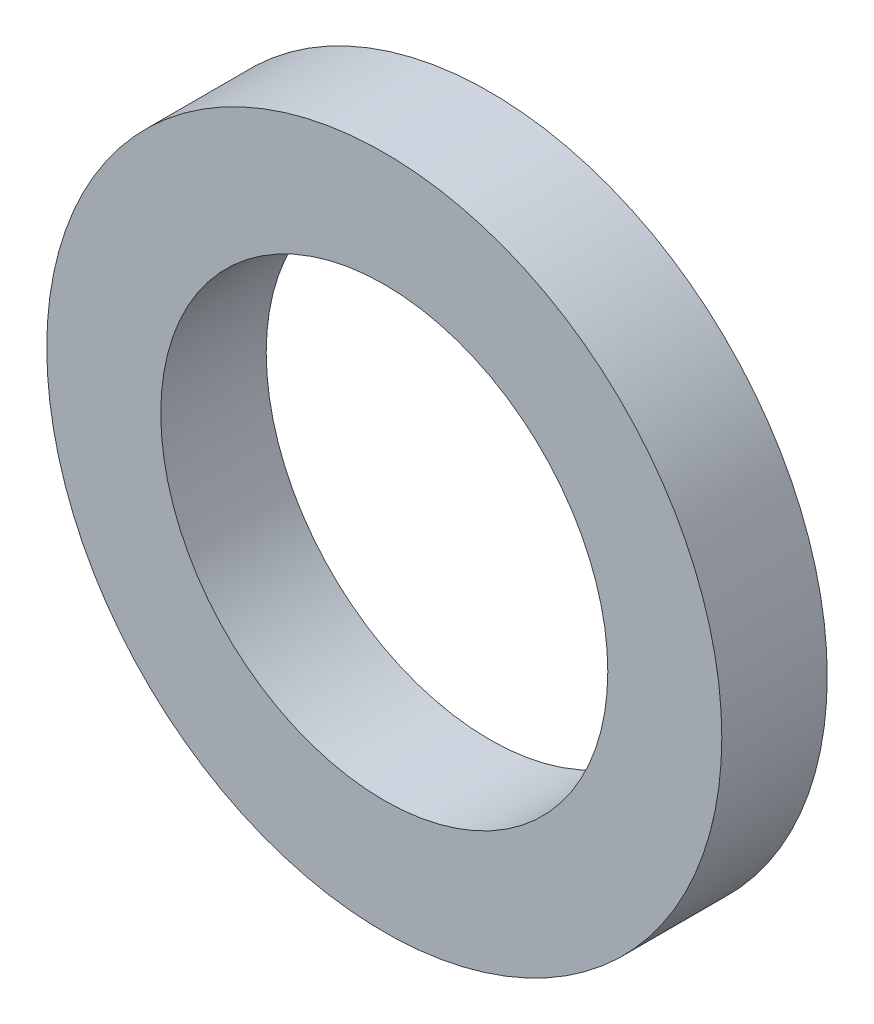
ISO-10303-21;
HEADER;
FILE_DESCRIPTION(('STEP AP214'),'2;1');
FILE_NAME('part.step','',(''),(''),'','','');
FILE_SCHEMA(('AUTOMOTIVE_DESIGN { 1 0 10303 214 1 1 1 1 }'));
ENDSEC;
DATA;
#1=APPLICATION_CONTEXT('core data for automotive mechanical design processes');
#2=APPLICATION_PROTOCOL_DEFINITION('international standard','automotive_design',2000,#1);
#3=PRODUCT_CONTEXT('',#1,'mechanical');
#4=PRODUCT('Part','Part','',(#3));
#5=PRODUCT_RELATED_PRODUCT_CATEGORY('part','',(#4));
#6=PRODUCT_DEFINITION_FORMATION('','',#4);
#7=PRODUCT_DEFINITION_CONTEXT('part definition',#1,'design');
#8=PRODUCT_DEFINITION('design','',#6,#7);
#9=PRODUCT_DEFINITION_SHAPE('','',#8);
#10=(LENGTH_UNIT() NAMED_UNIT(*) SI_UNIT(.MILLI.,.METRE.));
#11=(NAMED_UNIT(*) PLANE_ANGLE_UNIT() SI_UNIT($,.RADIAN.));
#12=(NAMED_UNIT(*) SI_UNIT($,.STERADIAN.) SOLID_ANGLE_UNIT());
#13=UNCERTAINTY_MEASURE_WITH_UNIT(LENGTH_MEASURE(1.E-05),#10,'distance_accuracy_value','');
#14=(GEOMETRIC_REPRESENTATION_CONTEXT(3) GLOBAL_UNCERTAINTY_ASSIGNED_CONTEXT((#13)) GLOBAL_UNIT_ASSIGNED_CONTEXT((#10,
#11,#12)) REPRESENTATION_CONTEXT('',''));
#15=CARTESIAN_POINT('',(0.,0.,0.));
#16=DIRECTION('',(0.,0.,1.));
#17=DIRECTION('',(1.,0.,0.));
#18=AXIS2_PLACEMENT_3D('',#15,#16,#17);
#19=CARTESIAN_POINT('',(0.,0.,1.5));
#20=DIRECTION('',(0.,0.,1.));
#21=DIRECTION('',(1.,0.,0.));
#22=AXIS2_PLACEMENT_3D('',#19,#20,#21);
#23=PLANE('',#22);
#24=CARTESIAN_POINT('',(0.,0.,1.5));
#25=DIRECTION('',(0.,0.,1.));
#26=DIRECTION('',(1.,0.,0.));
#27=AXIS2_PLACEMENT_3D('',#24,#25,#26);
#28=CIRCLE('',#27,4.80196953883257);
#29=CARTESIAN_POINT('',(4.80196953883257,0.,1.5));
#30=VERTEX_POINT('',#29);
#31=EDGE_CURVE('E10',#30,#30,#28,.T.);
#32=ORIENTED_EDGE('',*,*,#31,.T.);
#33=EDGE_LOOP('',(#32));
#34=FACE_BOUND('',#33,.T.);
#35=CARTESIAN_POINT('',(0.,0.,1.5));
#36=DIRECTION('',(0.,0.,1.));
#37=DIRECTION('',(1.,0.,0.));
#38=AXIS2_PLACEMENT_3D('',#35,#36,#37);
#39=CIRCLE('',#38,3.18);
#40=CARTESIAN_POINT('',(3.18,0.,1.5));
#41=VERTEX_POINT('',#40);
#42=EDGE_CURVE('E52',#41,#41,#39,.T.);
#43=ORIENTED_EDGE('',*,*,#42,.F.);
#44=EDGE_LOOP('',(#43));
#45=FACE_BOUND('',#44,.T.);
#46=ADVANCED_FACE('F39',(#34,#45),#23,.T.);
#47=CARTESIAN_POINT('',(0.,0.,0.));
#48=DIRECTION('',(0.,0.,1.));
#49=DIRECTION('',(1.,0.,0.));
#50=AXIS2_PLACEMENT_3D('',#47,#48,#49);
#51=PLANE('',#50);
#52=CARTESIAN_POINT('',(0.,0.,0.));
#53=DIRECTION('',(0.,0.,1.));
#54=DIRECTION('',(1.,0.,0.));
#55=AXIS2_PLACEMENT_3D('',#52,#53,#54);
#56=CIRCLE('',#55,4.80196953883257);
#57=CARTESIAN_POINT('',(4.80196953883257,0.,0.));
#58=VERTEX_POINT('',#57);
#59=EDGE_CURVE('E43',#58,#58,#56,.T.);
#60=ORIENTED_EDGE('',*,*,#59,.F.);
#61=EDGE_LOOP('',(#60));
#62=FACE_BOUND('',#61,.T.);
#63=CARTESIAN_POINT('',(0.,0.,0.));
#64=DIRECTION('',(0.,0.,1.));
#65=DIRECTION('',(1.,0.,0.));
#66=AXIS2_PLACEMENT_3D('',#63,#64,#65);
#67=CIRCLE('',#66,3.18);
#68=CARTESIAN_POINT('',(3.18,0.,0.));
#69=VERTEX_POINT('',#68);
#70=EDGE_CURVE('E54',#69,#69,#67,.T.);
#71=ORIENTED_EDGE('',*,*,#70,.T.);
#72=EDGE_LOOP('',(#71));
#73=FACE_BOUND('',#72,.T.);
#74=ADVANCED_FACE('F66',(#62,#73),#51,.F.);
#75=CARTESIAN_POINT('',(0.,0.,1.5));
#76=DIRECTION('',(0.,0.,-1.));
#77=DIRECTION('',(-1.,0.,0.));
#78=AXIS2_PLACEMENT_3D('',#75,#76,#77);
#79=CYLINDRICAL_SURFACE('',#78,4.80196953883257);
#80=ORIENTED_EDGE('',*,*,#31,.F.);
#81=EDGE_LOOP('',(#80));
#82=FACE_BOUND('',#81,.T.);
#83=ORIENTED_EDGE('',*,*,#59,.T.);
#84=EDGE_LOOP('',(#83));
#85=FACE_BOUND('',#84,.T.);
#86=ADVANCED_FACE('F41',(#82,#85),#79,.T.);
#87=CARTESIAN_POINT('',(0.,0.,1.5));
#88=DIRECTION('',(0.,0.,-1.));
#89=DIRECTION('',(-1.,0.,0.));
#90=AXIS2_PLACEMENT_3D('',#87,#88,#89);
#91=CYLINDRICAL_SURFACE('',#90,3.18);
#92=ORIENTED_EDGE('',*,*,#42,.T.);
#93=EDGE_LOOP('',(#92));
#94=FACE_BOUND('',#93,.T.);
#95=ORIENTED_EDGE('',*,*,#70,.F.);
#96=EDGE_LOOP('',(#95));
#97=FACE_BOUND('',#96,.T.);
#98=ADVANCED_FACE('F62',(#94,#97),#91,.F.);
#99=CLOSED_SHELL('',(#46,#74,#86,#98));
#100=MANIFOLD_SOLID_BREP('B2',#99);
#101=ADVANCED_BREP_SHAPE_REPRESENTATION('',(#18,#100),#14);
#102=SHAPE_DEFINITION_REPRESENTATION(#9,#101);
ENDSEC;
END-ISO-10303-21;
